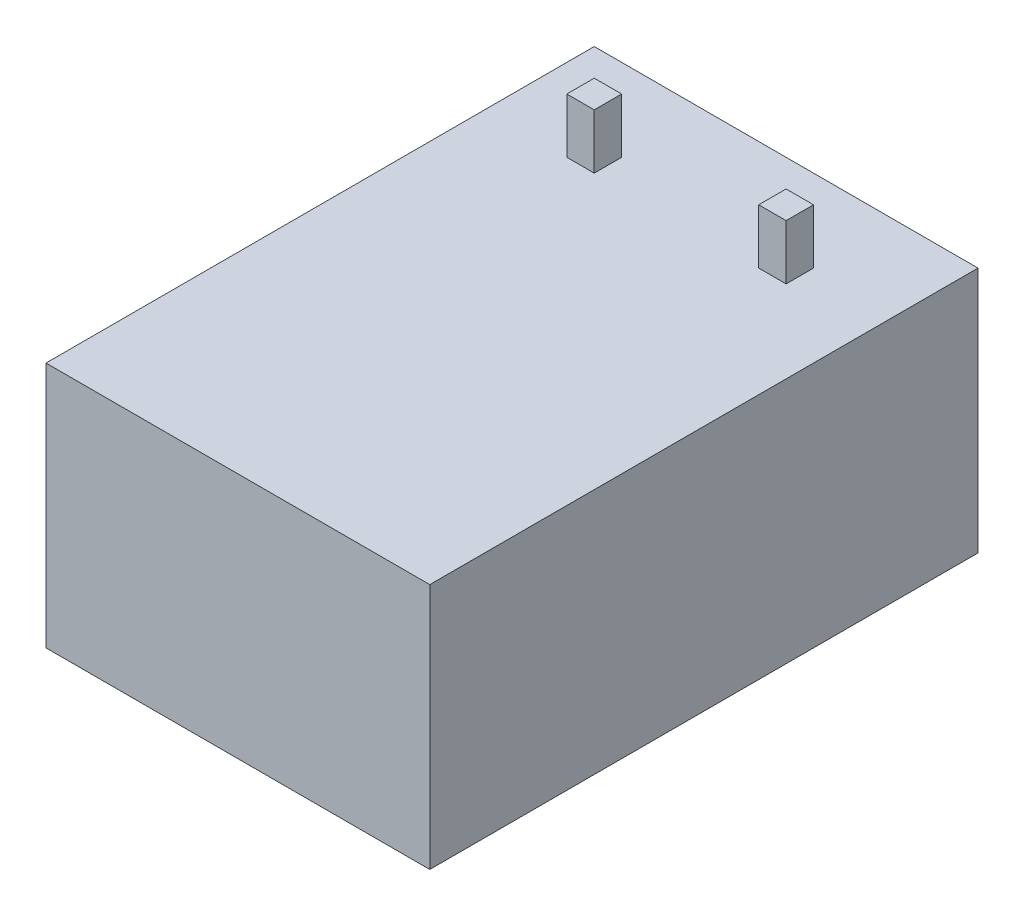
ISO-10303-21;
HEADER;
FILE_DESCRIPTION(('STEP AP214'),'2;1');
FILE_NAME('part.step','',(''),(''),'','','');
FILE_SCHEMA(('AUTOMOTIVE_DESIGN { 1 0 10303 214 1 1 1 1 }'));
ENDSEC;
DATA;
#1=APPLICATION_CONTEXT('core data for automotive mechanical design processes');
#2=APPLICATION_PROTOCOL_DEFINITION('international standard','automotive_design',2000,#1);
#3=PRODUCT_CONTEXT('',#1,'mechanical');
#4=PRODUCT('Part','Part','',(#3));
#5=PRODUCT_RELATED_PRODUCT_CATEGORY('part','',(#4));
#6=PRODUCT_DEFINITION_FORMATION('','',#4);
#7=PRODUCT_DEFINITION_CONTEXT('part definition',#1,'design');
#8=PRODUCT_DEFINITION('design','',#6,#7);
#9=PRODUCT_DEFINITION_SHAPE('','',#8);
#10=(LENGTH_UNIT() NAMED_UNIT(*) SI_UNIT(.MILLI.,.METRE.));
#11=(NAMED_UNIT(*) PLANE_ANGLE_UNIT() SI_UNIT($,.RADIAN.));
#12=(NAMED_UNIT(*) SI_UNIT($,.STERADIAN.) SOLID_ANGLE_UNIT());
#13=UNCERTAINTY_MEASURE_WITH_UNIT(LENGTH_MEASURE(1.E-05),#10,'distance_accuracy_value','');
#14=(GEOMETRIC_REPRESENTATION_CONTEXT(3) GLOBAL_UNCERTAINTY_ASSIGNED_CONTEXT((#13)) GLOBAL_UNIT_ASSIGNED_CONTEXT((#10,
#11,#12)) REPRESENTATION_CONTEXT('',''));
#15=CARTESIAN_POINT('',(0.,0.,0.));
#16=DIRECTION('',(0.,0.,1.));
#17=DIRECTION('',(1.,0.,0.));
#18=AXIS2_PLACEMENT_3D('',#15,#16,#17);
#19=CARTESIAN_POINT('',(0.,45.,0.));
#20=DIRECTION('',(0.,1.,0.));
#21=DIRECTION('',(0.,0.,1.));
#22=AXIS2_PLACEMENT_3D('',#19,#20,#21);
#23=PLANE('',#22);
#24=DIRECTION('',(0.,0.,-1.));
#25=VECTOR('',#24,1.);
#26=CARTESIAN_POINT('',(35.,45.,-50.));
#27=LINE('',#26,#25);
#28=CARTESIAN_POINT('',(35.,45.,50.));
#29=VERTEX_POINT('',#28);
#30=CARTESIAN_POINT('',(35.,45.,-50.));
#31=VERTEX_POINT('',#30);
#32=EDGE_CURVE('E189',#29,#31,#27,.T.);
#33=ORIENTED_EDGE('',*,*,#32,.T.);
#34=DIRECTION('',(-1.,0.,0.));
#35=VECTOR('',#34,1.);
#36=CARTESIAN_POINT('',(-35.,45.,-50.));
#37=LINE('',#36,#35);
#38=CARTESIAN_POINT('',(-35.,45.,-50.));
#39=VERTEX_POINT('',#38);
#40=EDGE_CURVE('E192',#31,#39,#37,.T.);
#41=ORIENTED_EDGE('',*,*,#40,.T.);
#42=DIRECTION('',(0.,0.,1.));
#43=VECTOR('',#42,1.);
#44=CARTESIAN_POINT('',(-35.,45.,-50.));
#45=LINE('',#44,#43);
#46=CARTESIAN_POINT('',(-35.,45.,50.));
#47=VERTEX_POINT('',#46);
#48=EDGE_CURVE('E195',#39,#47,#45,.T.);
#49=ORIENTED_EDGE('',*,*,#48,.T.);
#50=DIRECTION('',(1.,0.,0.));
#51=VECTOR('',#50,1.);
#52=CARTESIAN_POINT('',(-35.,45.,50.));
#53=LINE('',#52,#51);
#54=EDGE_CURVE('E197',#47,#29,#53,.T.);
#55=ORIENTED_EDGE('',*,*,#54,.T.);
#56=EDGE_LOOP('',(#33,#41,#49,#55));
#57=FACE_BOUND('',#56,.T.);
#58=DIRECTION('',(1.,0.,0.));
#59=VECTOR('',#58,1.);
#60=CARTESIAN_POINT('',(-20.,45.,-30.));
#61=LINE('',#60,#59);
#62=CARTESIAN_POINT('',(-20.,45.,-30.));
#63=VERTEX_POINT('',#62);
#64=CARTESIAN_POINT('',(-15.,45.,-30.));
#65=VERTEX_POINT('',#64);
#66=EDGE_CURVE('E177',#63,#65,#61,.T.);
#67=ORIENTED_EDGE('',*,*,#66,.F.);
#68=DIRECTION('',(0.,0.,1.));
#69=VECTOR('',#68,1.);
#70=CARTESIAN_POINT('',(-20.,45.,-35.));
#71=LINE('',#70,#69);
#72=CARTESIAN_POINT('',(-20.,45.,-35.));
#73=VERTEX_POINT('',#72);
#74=EDGE_CURVE('E179',#73,#63,#71,.T.);
#75=ORIENTED_EDGE('',*,*,#74,.F.);
#76=DIRECTION('',(-1.,0.,0.));
#77=VECTOR('',#76,1.);
#78=CARTESIAN_POINT('',(-20.,45.,-35.));
#79=LINE('',#78,#77);
#80=CARTESIAN_POINT('',(-15.,45.,-35.));
#81=VERTEX_POINT('',#80);
#82=EDGE_CURVE('E172',#81,#73,#79,.T.);
#83=ORIENTED_EDGE('',*,*,#82,.F.);
#84=DIRECTION('',(0.,0.,-1.));
#85=VECTOR('',#84,1.);
#86=CARTESIAN_POINT('',(-15.,45.,-35.));
#87=LINE('',#86,#85);
#88=EDGE_CURVE('E174',#65,#81,#87,.T.);
#89=ORIENTED_EDGE('',*,*,#88,.F.);
#90=EDGE_LOOP('',(#67,#75,#83,#89));
#91=FACE_BOUND('',#90,.T.);
#92=DIRECTION('',(1.,0.,0.));
#93=VECTOR('',#92,1.);
#94=CARTESIAN_POINT('',(15.,45.,-30.));
#95=LINE('',#94,#93);
#96=CARTESIAN_POINT('',(15.,45.,-30.));
#97=VERTEX_POINT('',#96);
#98=CARTESIAN_POINT('',(20.,45.,-30.));
#99=VERTEX_POINT('',#98);
#100=EDGE_CURVE('E360',#97,#99,#95,.T.);
#101=ORIENTED_EDGE('',*,*,#100,.F.);
#102=DIRECTION('',(0.,0.,1.));
#103=VECTOR('',#102,1.);
#104=CARTESIAN_POINT('',(15.,45.,-35.));
#105=LINE('',#104,#103);
#106=CARTESIAN_POINT('',(15.,45.,-35.));
#107=VERTEX_POINT('',#106);
#108=EDGE_CURVE('E152',#107,#97,#105,.T.);
#109=ORIENTED_EDGE('',*,*,#108,.F.);
#110=DIRECTION('',(-1.,0.,0.));
#111=VECTOR('',#110,1.);
#112=CARTESIAN_POINT('',(15.,45.,-35.));
#113=LINE('',#112,#111);
#114=CARTESIAN_POINT('',(20.,45.,-35.));
#115=VERTEX_POINT('',#114);
#116=EDGE_CURVE('E148',#115,#107,#113,.T.);
#117=ORIENTED_EDGE('',*,*,#116,.F.);
#118=DIRECTION('',(0.,0.,-1.));
#119=VECTOR('',#118,1.);
#120=CARTESIAN_POINT('',(20.,45.,-35.));
#121=LINE('',#120,#119);
#122=EDGE_CURVE('E357',#99,#115,#121,.T.);
#123=ORIENTED_EDGE('',*,*,#122,.F.);
#124=EDGE_LOOP('',(#101,#109,#117,#123));
#125=FACE_BOUND('',#124,.T.);
#126=ADVANCED_FACE('F39',(#57,#91,#125),#23,.T.);
#127=CARTESIAN_POINT('',(35.,45.,-50.));
#128=DIRECTION('',(-1.,0.,0.));
#129=DIRECTION('',(0.,0.,1.));
#130=AXIS2_PLACEMENT_3D('',#127,#128,#129);
#131=PLANE('',#130);
#132=DIRECTION('',(0.,0.,-1.));
#133=VECTOR('',#132,1.);
#134=CARTESIAN_POINT('',(35.,0.,-50.));
#135=LINE('',#134,#133);
#136=CARTESIAN_POINT('',(35.,0.,50.));
#137=VERTEX_POINT('',#136);
#138=CARTESIAN_POINT('',(35.,0.,-50.));
#139=VERTEX_POINT('',#138);
#140=EDGE_CURVE('E154',#137,#139,#135,.T.);
#141=ORIENTED_EDGE('',*,*,#140,.T.);
#142=DIRECTION('',(0.,-1.,0.));
#143=VECTOR('',#142,1.);
#144=CARTESIAN_POINT('',(35.,45.,-50.));
#145=LINE('',#144,#143);
#146=EDGE_CURVE('E11',#31,#139,#145,.T.);
#147=ORIENTED_EDGE('',*,*,#146,.F.);
#148=ORIENTED_EDGE('',*,*,#32,.F.);
#149=DIRECTION('',(0.,-1.,0.));
#150=VECTOR('',#149,1.);
#151=CARTESIAN_POINT('',(35.,45.,50.));
#152=LINE('',#151,#150);
#153=EDGE_CURVE('E198',#29,#137,#152,.T.);
#154=ORIENTED_EDGE('',*,*,#153,.T.);
#155=EDGE_LOOP('',(#141,#147,#148,#154));
#156=FACE_BOUND('',#155,.T.);
#157=ADVANCED_FACE('F41',(#156),#131,.F.);
#158=CARTESIAN_POINT('',(-35.,45.,-50.));
#159=DIRECTION('',(0.,0.,1.));
#160=DIRECTION('',(1.,0.,0.));
#161=AXIS2_PLACEMENT_3D('',#158,#159,#160);
#162=PLANE('',#161);
#163=DIRECTION('',(-1.,0.,0.));
#164=VECTOR('',#163,1.);
#165=CARTESIAN_POINT('',(-35.,0.,-50.));
#166=LINE('',#165,#164);
#167=CARTESIAN_POINT('',(-35.,0.,-50.));
#168=VERTEX_POINT('',#167);
#169=EDGE_CURVE('E157',#139,#168,#166,.T.);
#170=ORIENTED_EDGE('',*,*,#169,.T.);
#171=DIRECTION('',(0.,-1.,0.));
#172=VECTOR('',#171,1.);
#173=CARTESIAN_POINT('',(-35.,45.,-50.));
#174=LINE('',#173,#172);
#175=EDGE_CURVE('E47',#39,#168,#174,.T.);
#176=ORIENTED_EDGE('',*,*,#175,.F.);
#177=ORIENTED_EDGE('',*,*,#40,.F.);
#178=ORIENTED_EDGE('',*,*,#146,.T.);
#179=EDGE_LOOP('',(#170,#176,#177,#178));
#180=FACE_BOUND('',#179,.T.);
#181=ADVANCED_FACE('F229',(#180),#162,.F.);
#182=CARTESIAN_POINT('',(-35.,45.,-50.));
#183=DIRECTION('',(1.,0.,0.));
#184=DIRECTION('',(0.,0.,-1.));
#185=AXIS2_PLACEMENT_3D('',#182,#183,#184);
#186=PLANE('',#185);
#187=DIRECTION('',(0.,0.,1.));
#188=VECTOR('',#187,1.);
#189=CARTESIAN_POINT('',(-35.,0.,-50.));
#190=LINE('',#189,#188);
#191=CARTESIAN_POINT('',(-35.,0.,50.));
#192=VERTEX_POINT('',#191);
#193=EDGE_CURVE('E201',#168,#192,#190,.T.);
#194=ORIENTED_EDGE('',*,*,#193,.T.);
#195=DIRECTION('',(0.,-1.,0.));
#196=VECTOR('',#195,1.);
#197=CARTESIAN_POINT('',(-35.,45.,50.));
#198=LINE('',#197,#196);
#199=EDGE_CURVE('E206',#47,#192,#198,.T.);
#200=ORIENTED_EDGE('',*,*,#199,.F.);
#201=ORIENTED_EDGE('',*,*,#48,.F.);
#202=ORIENTED_EDGE('',*,*,#175,.T.);
#203=EDGE_LOOP('',(#194,#200,#201,#202));
#204=FACE_BOUND('',#203,.T.);
#205=ADVANCED_FACE('F213',(#204),#186,.F.);
#206=CARTESIAN_POINT('',(-35.,45.,50.));
#207=DIRECTION('',(0.,0.,-1.));
#208=DIRECTION('',(-1.,0.,0.));
#209=AXIS2_PLACEMENT_3D('',#206,#207,#208);
#210=PLANE('',#209);
#211=DIRECTION('',(1.,0.,0.));
#212=VECTOR('',#211,1.);
#213=CARTESIAN_POINT('',(-35.,0.,50.));
#214=LINE('',#213,#212);
#215=EDGE_CURVE('E193',#192,#137,#214,.T.);
#216=ORIENTED_EDGE('',*,*,#215,.T.);
#217=ORIENTED_EDGE('',*,*,#153,.F.);
#218=ORIENTED_EDGE('',*,*,#54,.F.);
#219=ORIENTED_EDGE('',*,*,#199,.T.);
#220=EDGE_LOOP('',(#216,#217,#218,#219));
#221=FACE_BOUND('',#220,.T.);
#222=ADVANCED_FACE('F222',(#221),#210,.F.);
#223=CARTESIAN_POINT('',(0.,0.,0.));
#224=DIRECTION('',(0.,1.,0.));
#225=DIRECTION('',(0.,0.,1.));
#226=AXIS2_PLACEMENT_3D('',#223,#224,#225);
#227=PLANE('',#226);
#228=ORIENTED_EDGE('',*,*,#140,.F.);
#229=ORIENTED_EDGE('',*,*,#215,.F.);
#230=ORIENTED_EDGE('',*,*,#193,.F.);
#231=ORIENTED_EDGE('',*,*,#169,.F.);
#232=EDGE_LOOP('',(#228,#229,#230,#231));
#233=FACE_BOUND('',#232,.T.);
#234=ADVANCED_FACE('F219',(#233),#227,.F.);
#235=CARTESIAN_POINT('',(-20.,55.,-35.));
#236=DIRECTION('',(1.,0.,0.));
#237=DIRECTION('',(0.,0.,-1.));
#238=AXIS2_PLACEMENT_3D('',#235,#236,#237);
#239=PLANE('',#238);
#240=ORIENTED_EDGE('',*,*,#74,.T.);
#241=DIRECTION('',(0.,-1.,0.));
#242=VECTOR('',#241,1.);
#243=CARTESIAN_POINT('',(-20.,55.,-30.));
#244=LINE('',#243,#242);
#245=CARTESIAN_POINT('',(-20.,55.,-30.));
#246=VERTEX_POINT('',#245);
#247=EDGE_CURVE('E162',#246,#63,#244,.T.);
#248=ORIENTED_EDGE('',*,*,#247,.F.);
#249=DIRECTION('',(0.,0.,1.));
#250=VECTOR('',#249,1.);
#251=CARTESIAN_POINT('',(-20.,55.,-35.));
#252=LINE('',#251,#250);
#253=CARTESIAN_POINT('',(-20.,55.,-35.));
#254=VERTEX_POINT('',#253);
#255=EDGE_CURVE('E175',#254,#246,#252,.T.);
#256=ORIENTED_EDGE('',*,*,#255,.F.);
#257=DIRECTION('',(0.,-1.,0.));
#258=VECTOR('',#257,1.);
#259=CARTESIAN_POINT('',(-20.,55.,-35.));
#260=LINE('',#259,#258);
#261=EDGE_CURVE('E168',#254,#73,#260,.T.);
#262=ORIENTED_EDGE('',*,*,#261,.T.);
#263=EDGE_LOOP('',(#240,#248,#256,#262));
#264=FACE_BOUND('',#263,.T.);
#265=ADVANCED_FACE('F247',(#264),#239,.F.);
#266=CARTESIAN_POINT('',(-20.,55.,-30.));
#267=DIRECTION('',(0.,0.,-1.));
#268=DIRECTION('',(-1.,0.,0.));
#269=AXIS2_PLACEMENT_3D('',#266,#267,#268);
#270=PLANE('',#269);
#271=ORIENTED_EDGE('',*,*,#66,.T.);
#272=DIRECTION('',(0.,-1.,0.));
#273=VECTOR('',#272,1.);
#274=CARTESIAN_POINT('',(-15.,55.,-30.));
#275=LINE('',#274,#273);
#276=CARTESIAN_POINT('',(-15.,55.,-30.));
#277=VERTEX_POINT('',#276);
#278=EDGE_CURVE('E164',#277,#65,#275,.T.);
#279=ORIENTED_EDGE('',*,*,#278,.F.);
#280=DIRECTION('',(1.,0.,0.));
#281=VECTOR('',#280,1.);
#282=CARTESIAN_POINT('',(-20.,55.,-30.));
#283=LINE('',#282,#281);
#284=EDGE_CURVE('E185',#246,#277,#283,.T.);
#285=ORIENTED_EDGE('',*,*,#284,.F.);
#286=ORIENTED_EDGE('',*,*,#247,.T.);
#287=EDGE_LOOP('',(#271,#279,#285,#286));
#288=FACE_BOUND('',#287,.T.);
#289=ADVANCED_FACE('F271',(#288),#270,.F.);
#290=CARTESIAN_POINT('',(-15.,55.,-35.));
#291=DIRECTION('',(-1.,0.,0.));
#292=DIRECTION('',(0.,0.,1.));
#293=AXIS2_PLACEMENT_3D('',#290,#291,#292);
#294=PLANE('',#293);
#295=ORIENTED_EDGE('',*,*,#88,.T.);
#296=DIRECTION('',(0.,-1.,0.));
#297=VECTOR('',#296,1.);
#298=CARTESIAN_POINT('',(-15.,55.,-35.));
#299=LINE('',#298,#297);
#300=CARTESIAN_POINT('',(-15.,55.,-35.));
#301=VERTEX_POINT('',#300);
#302=EDGE_CURVE('E62',#301,#81,#299,.T.);
#303=ORIENTED_EDGE('',*,*,#302,.F.);
#304=DIRECTION('',(0.,0.,-1.));
#305=VECTOR('',#304,1.);
#306=CARTESIAN_POINT('',(-15.,55.,-35.));
#307=LINE('',#306,#305);
#308=EDGE_CURVE('E183',#277,#301,#307,.T.);
#309=ORIENTED_EDGE('',*,*,#308,.F.);
#310=ORIENTED_EDGE('',*,*,#278,.T.);
#311=EDGE_LOOP('',(#295,#303,#309,#310));
#312=FACE_BOUND('',#311,.T.);
#313=ADVANCED_FACE('F281',(#312),#294,.F.);
#314=CARTESIAN_POINT('',(-20.,55.,-35.));
#315=DIRECTION('',(0.,0.,1.));
#316=DIRECTION('',(1.,0.,0.));
#317=AXIS2_PLACEMENT_3D('',#314,#315,#316);
#318=PLANE('',#317);
#319=ORIENTED_EDGE('',*,*,#82,.T.);
#320=ORIENTED_EDGE('',*,*,#261,.F.);
#321=DIRECTION('',(-1.,0.,0.));
#322=VECTOR('',#321,1.);
#323=CARTESIAN_POINT('',(-20.,55.,-35.));
#324=LINE('',#323,#322);
#325=EDGE_CURVE('E171',#301,#254,#324,.T.);
#326=ORIENTED_EDGE('',*,*,#325,.F.);
#327=ORIENTED_EDGE('',*,*,#302,.T.);
#328=EDGE_LOOP('',(#319,#320,#326,#327));
#329=FACE_BOUND('',#328,.T.);
#330=ADVANCED_FACE('F291',(#329),#318,.F.);
#331=CARTESIAN_POINT('',(0.,55.,0.));
#332=DIRECTION('',(0.,1.,0.));
#333=DIRECTION('',(0.,0.,1.));
#334=AXIS2_PLACEMENT_3D('',#331,#332,#333);
#335=PLANE('',#334);
#336=ORIENTED_EDGE('',*,*,#255,.T.);
#337=ORIENTED_EDGE('',*,*,#284,.T.);
#338=ORIENTED_EDGE('',*,*,#308,.T.);
#339=ORIENTED_EDGE('',*,*,#325,.T.);
#340=EDGE_LOOP('',(#336,#337,#338,#339));
#341=FACE_BOUND('',#340,.T.);
#342=ADVANCED_FACE('F244',(#341),#335,.T.);
#343=CARTESIAN_POINT('',(15.,55.,-35.));
#344=DIRECTION('',(1.,0.,0.));
#345=DIRECTION('',(0.,0.,-1.));
#346=AXIS2_PLACEMENT_3D('',#343,#344,#345);
#347=PLANE('',#346);
#348=ORIENTED_EDGE('',*,*,#108,.T.);
#349=DIRECTION('',(0.,-1.,0.));
#350=VECTOR('',#349,1.);
#351=CARTESIAN_POINT('',(15.,55.,-30.));
#352=LINE('',#351,#350);
#353=CARTESIAN_POINT('',(15.,55.,-30.));
#354=VERTEX_POINT('',#353);
#355=EDGE_CURVE('E133',#354,#97,#352,.T.);
#356=ORIENTED_EDGE('',*,*,#355,.F.);
#357=DIRECTION('',(0.,0.,1.));
#358=VECTOR('',#357,1.);
#359=CARTESIAN_POINT('',(15.,55.,-35.));
#360=LINE('',#359,#358);
#361=CARTESIAN_POINT('',(15.,55.,-35.));
#362=VERTEX_POINT('',#361);
#363=EDGE_CURVE('E140',#362,#354,#360,.T.);
#364=ORIENTED_EDGE('',*,*,#363,.F.);
#365=DIRECTION('',(0.,-1.,0.));
#366=VECTOR('',#365,1.);
#367=CARTESIAN_POINT('',(15.,55.,-35.));
#368=LINE('',#367,#366);
#369=EDGE_CURVE('E354',#362,#107,#368,.T.);
#370=ORIENTED_EDGE('',*,*,#369,.T.);
#371=EDGE_LOOP('',(#348,#356,#364,#370));
#372=FACE_BOUND('',#371,.T.);
#373=ADVANCED_FACE('F150',(#372),#347,.F.);
#374=CARTESIAN_POINT('',(15.,55.,-30.));
#375=DIRECTION('',(0.,0.,-1.));
#376=DIRECTION('',(-1.,0.,0.));
#377=AXIS2_PLACEMENT_3D('',#374,#375,#376);
#378=PLANE('',#377);
#379=ORIENTED_EDGE('',*,*,#100,.T.);
#380=DIRECTION('',(0.,-1.,0.));
#381=VECTOR('',#380,1.);
#382=CARTESIAN_POINT('',(20.,55.,-30.));
#383=LINE('',#382,#381);
#384=CARTESIAN_POINT('',(20.,55.,-30.));
#385=VERTEX_POINT('',#384);
#386=EDGE_CURVE('E136',#385,#99,#383,.T.);
#387=ORIENTED_EDGE('',*,*,#386,.F.);
#388=DIRECTION('',(1.,0.,0.));
#389=VECTOR('',#388,1.);
#390=CARTESIAN_POINT('',(15.,55.,-30.));
#391=LINE('',#390,#389);
#392=EDGE_CURVE('E129',#354,#385,#391,.T.);
#393=ORIENTED_EDGE('',*,*,#392,.F.);
#394=ORIENTED_EDGE('',*,*,#355,.T.);
#395=EDGE_LOOP('',(#379,#387,#393,#394));
#396=FACE_BOUND('',#395,.T.);
#397=ADVANCED_FACE('F131',(#396),#378,.F.);
#398=CARTESIAN_POINT('',(20.,55.,-35.));
#399=DIRECTION('',(-1.,0.,0.));
#400=DIRECTION('',(0.,0.,1.));
#401=AXIS2_PLACEMENT_3D('',#398,#399,#400);
#402=PLANE('',#401);
#403=ORIENTED_EDGE('',*,*,#122,.T.);
#404=DIRECTION('',(0.,-1.,0.));
#405=VECTOR('',#404,1.);
#406=CARTESIAN_POINT('',(20.,55.,-35.));
#407=LINE('',#406,#405);
#408=CARTESIAN_POINT('',(20.,55.,-35.));
#409=VERTEX_POINT('',#408);
#410=EDGE_CURVE('E54',#409,#115,#407,.T.);
#411=ORIENTED_EDGE('',*,*,#410,.F.);
#412=DIRECTION('',(0.,0.,-1.));
#413=VECTOR('',#412,1.);
#414=CARTESIAN_POINT('',(20.,55.,-35.));
#415=LINE('',#414,#413);
#416=EDGE_CURVE('E139',#385,#409,#415,.T.);
#417=ORIENTED_EDGE('',*,*,#416,.F.);
#418=ORIENTED_EDGE('',*,*,#386,.T.);
#419=EDGE_LOOP('',(#403,#411,#417,#418));
#420=FACE_BOUND('',#419,.T.);
#421=ADVANCED_FACE('F324',(#420),#402,.F.);
#422=CARTESIAN_POINT('',(15.,55.,-35.));
#423=DIRECTION('',(0.,0.,1.));
#424=DIRECTION('',(1.,0.,0.));
#425=AXIS2_PLACEMENT_3D('',#422,#423,#424);
#426=PLANE('',#425);
#427=ORIENTED_EDGE('',*,*,#116,.T.);
#428=ORIENTED_EDGE('',*,*,#369,.F.);
#429=DIRECTION('',(-1.,0.,0.));
#430=VECTOR('',#429,1.);
#431=CARTESIAN_POINT('',(15.,55.,-35.));
#432=LINE('',#431,#430);
#433=EDGE_CURVE('E144',#409,#362,#432,.T.);
#434=ORIENTED_EDGE('',*,*,#433,.F.);
#435=ORIENTED_EDGE('',*,*,#410,.T.);
#436=EDGE_LOOP('',(#427,#428,#434,#435));
#437=FACE_BOUND('',#436,.T.);
#438=ADVANCED_FACE('F333',(#437),#426,.F.);
#439=CARTESIAN_POINT('',(0.,55.,0.));
#440=DIRECTION('',(0.,1.,0.));
#441=DIRECTION('',(0.,0.,1.));
#442=AXIS2_PLACEMENT_3D('',#439,#440,#441);
#443=PLANE('',#442);
#444=ORIENTED_EDGE('',*,*,#363,.T.);
#445=ORIENTED_EDGE('',*,*,#392,.T.);
#446=ORIENTED_EDGE('',*,*,#416,.T.);
#447=ORIENTED_EDGE('',*,*,#433,.T.);
#448=EDGE_LOOP('',(#444,#445,#446,#447));
#449=FACE_BOUND('',#448,.T.);
#450=ADVANCED_FACE('F143',(#449),#443,.T.);
#451=CLOSED_SHELL('',(#126,#157,#181,#205,#222,#234,#265,#289,#313,#330,#342,#373,#397,#421,
#438,#450));
#452=MANIFOLD_SOLID_BREP('B2',#451);
#453=ADVANCED_BREP_SHAPE_REPRESENTATION('',(#18,#452),#14);
#454=SHAPE_DEFINITION_REPRESENTATION(#9,#453);
ENDSEC;
END-ISO-10303-21;
